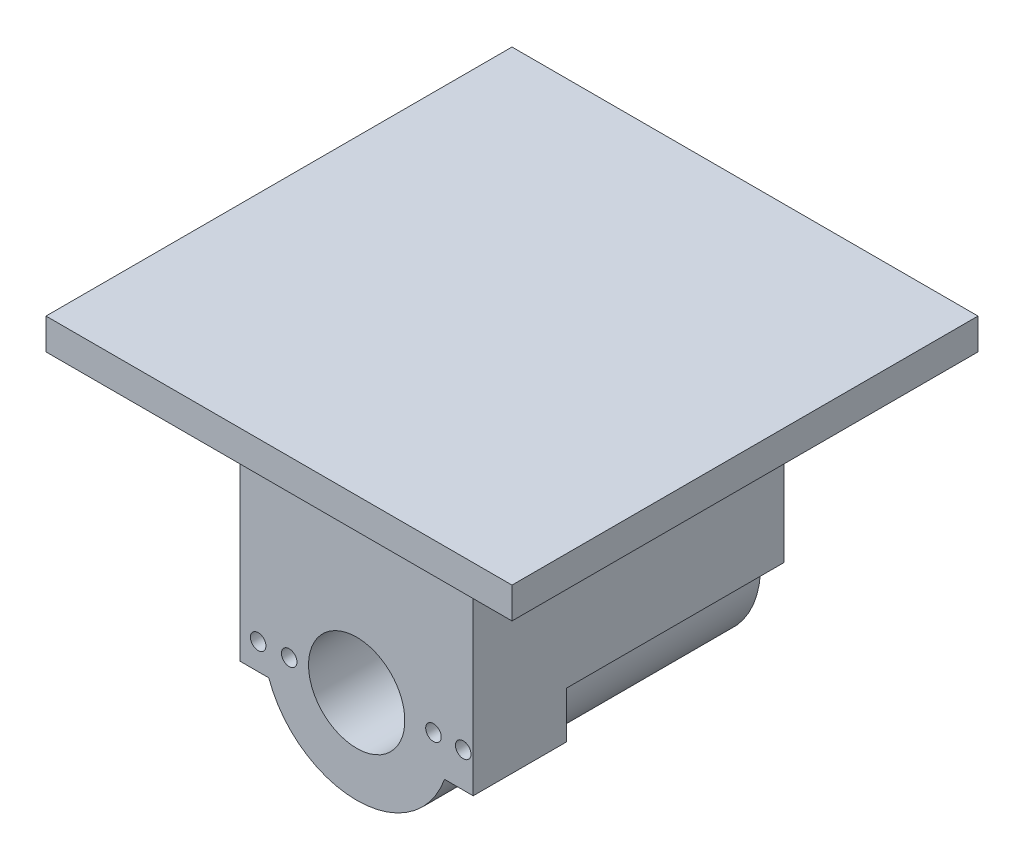
ISO-10303-21;
HEADER;
FILE_DESCRIPTION(('STEP AP214'),'2;1');
FILE_NAME('part.step','',(''),(''),'','','');
FILE_SCHEMA(('AUTOMOTIVE_DESIGN { 1 0 10303 214 1 1 1 1 }'));
ENDSEC;
DATA;
#1=APPLICATION_CONTEXT('core data for automotive mechanical design processes');
#2=APPLICATION_PROTOCOL_DEFINITION('international standard','automotive_design',2000,#1);
#3=PRODUCT_CONTEXT('',#1,'mechanical');
#4=PRODUCT('Part','Part','',(#3));
#5=PRODUCT_RELATED_PRODUCT_CATEGORY('part','',(#4));
#6=PRODUCT_DEFINITION_FORMATION('','',#4);
#7=PRODUCT_DEFINITION_CONTEXT('part definition',#1,'design');
#8=PRODUCT_DEFINITION('design','',#6,#7);
#9=PRODUCT_DEFINITION_SHAPE('','',#8);
#10=(LENGTH_UNIT() NAMED_UNIT(*) SI_UNIT(.MILLI.,.METRE.));
#11=(NAMED_UNIT(*) PLANE_ANGLE_UNIT() SI_UNIT($,.RADIAN.));
#12=(NAMED_UNIT(*) SI_UNIT($,.STERADIAN.) SOLID_ANGLE_UNIT());
#13=UNCERTAINTY_MEASURE_WITH_UNIT(LENGTH_MEASURE(1.E-05),#10,'distance_accuracy_value','');
#14=(GEOMETRIC_REPRESENTATION_CONTEXT(3) GLOBAL_UNCERTAINTY_ASSIGNED_CONTEXT((#13)) GLOBAL_UNIT_ASSIGNED_CONTEXT((#10,
#11,#12)) REPRESENTATION_CONTEXT('',''));
#15=CARTESIAN_POINT('',(0.,0.,0.));
#16=DIRECTION('',(0.,0.,1.));
#17=DIRECTION('',(1.,0.,0.));
#18=AXIS2_PLACEMENT_3D('',#15,#16,#17);
#19=CARTESIAN_POINT('',(0.,0.,20.));
#20=DIRECTION('',(0.,0.,-1.));
#21=DIRECTION('',(-1.,0.,0.));
#22=AXIS2_PLACEMENT_3D('',#19,#20,#21);
#23=CYLINDRICAL_SURFACE('',#22,6.);
#24=CARTESIAN_POINT('',(0.,0.,10.));
#25=DIRECTION('',(0.,0.,1.));
#26=DIRECTION('',(1.,0.,0.));
#27=AXIS2_PLACEMENT_3D('',#24,#25,#26);
#28=CIRCLE('',#27,6.);
#29=CARTESIAN_POINT('',(-5.99983233310653,0.0448550399568297,10.));
#30=VERTEX_POINT('',#29);
#31=CARTESIAN_POINT('',(-5.9648883188573,-0.648156881904196,10.));
#32=VERTEX_POINT('',#31);
#33=EDGE_CURVE('E292',#30,#32,#28,.T.);
#34=ORIENTED_EDGE('',*,*,#33,.F.);
#35=DIRECTION('',(0.,0.,1.));
#36=VECTOR('',#35,1.);
#37=CARTESIAN_POINT('',(-5.99983233310652,0.0448550399568282,15.));
#38=LINE('',#37,#36);
#39=CARTESIAN_POINT('',(-5.99983233310652,0.044855039956827,14.));
#40=VERTEX_POINT('',#39);
#41=EDGE_CURVE('E214',#30,#40,#38,.T.);
#42=ORIENTED_EDGE('',*,*,#41,.T.);
#43=CARTESIAN_POINT('',(0.,0.,14.));
#44=DIRECTION('',(0.,0.,1.));
#45=DIRECTION('',(1.,0.,0.));
#46=AXIS2_PLACEMENT_3D('',#43,#44,#45);
#47=CIRCLE('',#46,6.);
#48=CARTESIAN_POINT('',(-5.91607978309962,1.,14.));
#49=VERTEX_POINT('',#48);
#50=EDGE_CURVE('E224',#49,#40,#47,.T.);
#51=ORIENTED_EDGE('',*,*,#50,.F.);
#52=DIRECTION('',(0.,0.,-1.));
#53=VECTOR('',#52,1.);
#54=CARTESIAN_POINT('',(-5.91607978309962,1.,20.));
#55=LINE('',#54,#53);
#56=CARTESIAN_POINT('',(-5.91607978309961,1.,0.));
#57=VERTEX_POINT('',#56);
#58=EDGE_CURVE('E282',#49,#57,#55,.T.);
#59=ORIENTED_EDGE('',*,*,#58,.T.);
#60=CARTESIAN_POINT('',(0.,0.,0.));
#61=DIRECTION('',(0.,0.,1.));
#62=DIRECTION('',(1.,0.,0.));
#63=AXIS2_PLACEMENT_3D('',#60,#61,#62);
#64=CIRCLE('',#63,6.);
#65=CARTESIAN_POINT('',(5.91607978309962,1.,0.));
#66=VERTEX_POINT('',#65);
#67=EDGE_CURVE('E284',#57,#66,#64,.T.);
#68=ORIENTED_EDGE('',*,*,#67,.T.);
#69=DIRECTION('',(0.,0.,-1.));
#70=VECTOR('',#69,1.);
#71=CARTESIAN_POINT('',(5.91607978309962,1.,20.));
#72=LINE('',#71,#70);
#73=CARTESIAN_POINT('',(5.91607978309962,1.,14.));
#74=VERTEX_POINT('',#73);
#75=EDGE_CURVE('E279',#66,#74,#72,.F.);
#76=ORIENTED_EDGE('',*,*,#75,.T.);
#77=CARTESIAN_POINT('',(0.,0.,14.));
#78=DIRECTION('',(0.,0.,1.));
#79=DIRECTION('',(1.,0.,0.));
#80=AXIS2_PLACEMENT_3D('',#77,#78,#79);
#81=CIRCLE('',#80,6.);
#82=CARTESIAN_POINT('',(5.65685424949238,-2.,14.));
#83=VERTEX_POINT('',#82);
#84=EDGE_CURVE('E245',#83,#74,#81,.T.);
#85=ORIENTED_EDGE('',*,*,#84,.F.);
#86=DIRECTION('',(0.,0.,1.));
#87=VECTOR('',#86,1.);
#88=CARTESIAN_POINT('',(5.65685424949238,-2.,14.));
#89=LINE('',#88,#87);
#90=CARTESIAN_POINT('',(5.65685424949238,-2.,20.));
#91=VERTEX_POINT('',#90);
#92=EDGE_CURVE('E250',#83,#91,#89,.T.);
#93=ORIENTED_EDGE('',*,*,#92,.T.);
#94=CARTESIAN_POINT('',(0.,0.,20.));
#95=DIRECTION('',(0.,0.,1.));
#96=DIRECTION('',(1.,0.,0.));
#97=AXIS2_PLACEMENT_3D('',#94,#95,#96);
#98=CIRCLE('',#97,6.);
#99=CARTESIAN_POINT('',(-5.65685424949238,-2.,20.));
#100=VERTEX_POINT('',#99);
#101=EDGE_CURVE('E285',#100,#91,#98,.T.);
#102=ORIENTED_EDGE('',*,*,#101,.F.);
#103=DIRECTION('',(0.,0.,1.));
#104=VECTOR('',#103,1.);
#105=CARTESIAN_POINT('',(-5.65685424949238,-2.,14.));
#106=LINE('',#105,#104);
#107=CARTESIAN_POINT('',(-5.65685424949238,-2.,14.));
#108=VERTEX_POINT('',#107);
#109=EDGE_CURVE('E232',#108,#100,#106,.T.);
#110=ORIENTED_EDGE('',*,*,#109,.F.);
#111=CARTESIAN_POINT('',(-5.9648883188573,-0.648156881904193,14.));
#112=VERTEX_POINT('',#111);
#113=EDGE_CURVE('E223',#112,#108,#47,.T.);
#114=ORIENTED_EDGE('',*,*,#113,.F.);
#115=DIRECTION('',(0.,0.,1.));
#116=VECTOR('',#115,1.);
#117=CARTESIAN_POINT('',(-5.9648883188573,-0.648156881904194,15.));
#118=LINE('',#117,#116);
#119=EDGE_CURVE('E197',#112,#32,#118,.F.);
#120=ORIENTED_EDGE('',*,*,#119,.T.);
#121=EDGE_LOOP('',(#34,#42,#51,#59,#68,#76,#85,#93,#102,#110,#114,#120));
#122=FACE_BOUND('',#121,.T.);
#123=ADVANCED_FACE('F34',(#122),#23,.T.);
#124=CARTESIAN_POINT('',(0.,1.,0.));
#125=DIRECTION('',(0.,-1.,0.));
#126=DIRECTION('',(0.,0.,-1.));
#127=AXIS2_PLACEMENT_3D('',#124,#125,#126);
#128=PLANE('',#127);
#129=ORIENTED_EDGE('',*,*,#58,.F.);
#130=DIRECTION('',(1.,0.,0.));
#131=VECTOR('',#130,1.);
#132=CARTESIAN_POINT('',(0.,1.,14.));
#133=LINE('',#132,#131);
#134=CARTESIAN_POINT('',(-7.5,1.,14.));
#135=VERTEX_POINT('',#134);
#136=EDGE_CURVE('E227',#135,#49,#133,.T.);
#137=ORIENTED_EDGE('',*,*,#136,.F.);
#138=DIRECTION('',(0.,0.,1.));
#139=VECTOR('',#138,1.);
#140=CARTESIAN_POINT('',(-7.5,1.,0.));
#141=LINE('',#140,#139);
#142=CARTESIAN_POINT('',(-7.5,1.,0.));
#143=VERTEX_POINT('',#142);
#144=EDGE_CURVE('E259',#143,#135,#141,.T.);
#145=ORIENTED_EDGE('',*,*,#144,.F.);
#146=DIRECTION('',(-1.,0.,0.));
#147=VECTOR('',#146,1.);
#148=CARTESIAN_POINT('',(7.49999999999999,1.,0.));
#149=LINE('',#148,#147);
#150=EDGE_CURVE('E267',#57,#143,#149,.T.);
#151=ORIENTED_EDGE('',*,*,#150,.F.);
#152=EDGE_LOOP('',(#129,#137,#145,#151));
#153=FACE_BOUND('',#152,.T.);
#154=ADVANCED_FACE('F352',(#153),#128,.T.);
#155=DIRECTION('',(0.,0.,-1.));
#156=VECTOR('',#155,1.);
#157=CARTESIAN_POINT('',(7.49999999999999,1.,0.));
#158=LINE('',#157,#156);
#159=CARTESIAN_POINT('',(7.5,1.,14.));
#160=VERTEX_POINT('',#159);
#161=CARTESIAN_POINT('',(7.49999999999999,1.,0.));
#162=VERTEX_POINT('',#161);
#163=EDGE_CURVE('E264',#160,#162,#158,.T.);
#164=ORIENTED_EDGE('',*,*,#163,.F.);
#165=DIRECTION('',(1.,0.,0.));
#166=VECTOR('',#165,1.);
#167=CARTESIAN_POINT('',(0.,1.,14.));
#168=LINE('',#167,#166);
#169=EDGE_CURVE('E242',#74,#160,#168,.T.);
#170=ORIENTED_EDGE('',*,*,#169,.F.);
#171=ORIENTED_EDGE('',*,*,#75,.F.);
#172=EDGE_CURVE('E268',#162,#66,#149,.T.);
#173=ORIENTED_EDGE('',*,*,#172,.F.);
#174=EDGE_LOOP('',(#164,#170,#171,#173));
#175=FACE_BOUND('',#174,.T.);
#176=ADVANCED_FACE('F358',(#175),#128,.T.);
#177=CARTESIAN_POINT('',(0.,0.,20.));
#178=DIRECTION('',(0.,0.,1.));
#179=DIRECTION('',(1.,0.,0.));
#180=AXIS2_PLACEMENT_3D('',#177,#178,#179);
#181=PLANE('',#180);
#182=CARTESIAN_POINT('',(-6.3419428635684,-0.319782293495317,20.));
#183=DIRECTION('',(0.,0.,1.));
#184=DIRECTION('',(1.,0.,0.));
#185=AXIS2_PLACEMENT_3D('',#182,#183,#184);
#186=CIRCLE('',#185,0.499999999999999);
#187=CARTESIAN_POINT('',(-5.8419428635684,-0.319782293495317,20.));
#188=VERTEX_POINT('',#187);
#189=EDGE_CURVE('E198',#188,#188,#186,.T.);
#190=ORIENTED_EDGE('',*,*,#189,.F.);
#191=EDGE_LOOP('',(#190));
#192=FACE_BOUND('',#191,.T.);
#193=CARTESIAN_POINT('',(-4.34448054433424,-0.219063460898409,20.));
#194=DIRECTION('',(0.,0.,1.));
#195=DIRECTION('',(1.,0.,0.));
#196=AXIS2_PLACEMENT_3D('',#193,#194,#195);
#197=CIRCLE('',#196,0.499999999999999);
#198=CARTESIAN_POINT('',(-3.84448054433424,-0.219063460898409,20.));
#199=VERTEX_POINT('',#198);
#200=EDGE_CURVE('E204',#199,#199,#197,.T.);
#201=ORIENTED_EDGE('',*,*,#200,.F.);
#202=EDGE_LOOP('',(#201));
#203=FACE_BOUND('',#202,.T.);
#204=CARTESIAN_POINT('',(4.9437192401046,0.249279110677347,20.));
#205=DIRECTION('',(0.,0.,1.));
#206=DIRECTION('',(1.,0.,0.));
#207=AXIS2_PLACEMENT_3D('',#204,#205,#206);
#208=CIRCLE('',#207,0.499999999999999);
#209=CARTESIAN_POINT('',(5.4437192401046,0.249279110677347,20.));
#210=VERTEX_POINT('',#209);
#211=EDGE_CURVE('E188',#210,#210,#208,.T.);
#212=ORIENTED_EDGE('',*,*,#211,.F.);
#213=EDGE_LOOP('',(#212));
#214=FACE_BOUND('',#213,.T.);
#215=CARTESIAN_POINT('',(6.86042610133632,0.249279110677347,20.));
#216=DIRECTION('',(0.,0.,1.));
#217=DIRECTION('',(1.,0.,0.));
#218=AXIS2_PLACEMENT_3D('',#215,#216,#217);
#219=CIRCLE('',#218,0.499999999999999);
#220=CARTESIAN_POINT('',(7.36042610133632,0.249279110677347,20.));
#221=VERTEX_POINT('',#220);
#222=EDGE_CURVE('E185',#221,#221,#219,.T.);
#223=ORIENTED_EDGE('',*,*,#222,.F.);
#224=EDGE_LOOP('',(#223));
#225=FACE_BOUND('',#224,.T.);
#226=DIRECTION('',(0.,-1.,0.));
#227=VECTOR('',#226,1.);
#228=CARTESIAN_POINT('',(7.5,6.,20.));
#229=LINE('',#228,#227);
#230=CARTESIAN_POINT('',(7.5,11.,20.));
#231=VERTEX_POINT('',#230);
#232=CARTESIAN_POINT('',(7.5,-2.,20.));
#233=VERTEX_POINT('',#232);
#234=EDGE_CURVE('E275',#231,#233,#229,.T.);
#235=ORIENTED_EDGE('',*,*,#234,.F.);
#236=DIRECTION('',(1.,0.,0.));
#237=VECTOR('',#236,1.);
#238=CARTESIAN_POINT('',(-7.5,11.,20.));
#239=LINE('',#238,#237);
#240=CARTESIAN_POINT('',(-7.5,11.,20.));
#241=VERTEX_POINT('',#240);
#242=EDGE_CURVE('E58',#231,#241,#239,.F.);
#243=ORIENTED_EDGE('',*,*,#242,.T.);
#244=DIRECTION('',(0.,-1.,0.));
#245=VECTOR('',#244,1.);
#246=CARTESIAN_POINT('',(-7.5,6.,20.));
#247=LINE('',#246,#245);
#248=CARTESIAN_POINT('',(-7.5,-2.,20.));
#249=VERTEX_POINT('',#248);
#250=EDGE_CURVE('E277',#241,#249,#247,.T.);
#251=ORIENTED_EDGE('',*,*,#250,.T.);
#252=DIRECTION('',(-1.,0.,0.));
#253=VECTOR('',#252,1.);
#254=CARTESIAN_POINT('',(0.,-2.,20.));
#255=LINE('',#254,#253);
#256=EDGE_CURVE('E221',#100,#249,#255,.T.);
#257=ORIENTED_EDGE('',*,*,#256,.F.);
#258=ORIENTED_EDGE('',*,*,#101,.T.);
#259=DIRECTION('',(1.,0.,0.));
#260=VECTOR('',#259,1.);
#261=CARTESIAN_POINT('',(0.,-2.,20.));
#262=LINE('',#261,#260);
#263=EDGE_CURVE('E234',#91,#233,#262,.T.);
#264=ORIENTED_EDGE('',*,*,#263,.T.);
#265=EDGE_LOOP('',(#235,#243,#251,#257,#258,#264));
#266=FACE_BOUND('',#265,.T.);
#267=CARTESIAN_POINT('',(0.,0.,20.));
#268=DIRECTION('',(0.,0.,-1.));
#269=DIRECTION('',(-1.,0.,0.));
#270=AXIS2_PLACEMENT_3D('',#267,#268,#269);
#271=CIRCLE('',#270,3.1);
#272=CARTESIAN_POINT('',(-3.1,0.,20.));
#273=VERTEX_POINT('',#272);
#274=EDGE_CURVE('E256',#273,#273,#271,.T.);
#275=ORIENTED_EDGE('',*,*,#274,.T.);
#276=EDGE_LOOP('',(#275));
#277=FACE_BOUND('',#276,.T.);
#278=ADVANCED_FACE('F417',(#192,#203,#214,#225,#266,#277),#181,.T.);
#279=CARTESIAN_POINT('',(0.,0.,0.));
#280=DIRECTION('',(0.,0.,1.));
#281=DIRECTION('',(1.,0.,0.));
#282=AXIS2_PLACEMENT_3D('',#279,#280,#281);
#283=PLANE('',#282);
#284=CARTESIAN_POINT('',(0.,0.,0.));
#285=DIRECTION('',(0.,0.,-1.));
#286=DIRECTION('',(-1.,0.,0.));
#287=AXIS2_PLACEMENT_3D('',#284,#285,#286);
#288=CIRCLE('',#287,3.1);
#289=CARTESIAN_POINT('',(-3.1,0.,0.));
#290=VERTEX_POINT('',#289);
#291=EDGE_CURVE('E253',#290,#290,#288,.T.);
#292=ORIENTED_EDGE('',*,*,#291,.F.);
#293=EDGE_LOOP('',(#292));
#294=FACE_BOUND('',#293,.T.);
#295=DIRECTION('',(0.,-1.,0.));
#296=VECTOR('',#295,1.);
#297=CARTESIAN_POINT('',(-7.5,6.,0.));
#298=LINE('',#297,#296);
#299=CARTESIAN_POINT('',(-7.5,11.,0.));
#300=VERTEX_POINT('',#299);
#301=EDGE_CURVE('E271',#300,#143,#298,.T.);
#302=ORIENTED_EDGE('',*,*,#301,.F.);
#303=DIRECTION('',(-1.,0.,0.));
#304=VECTOR('',#303,1.);
#305=CARTESIAN_POINT('',(0.,11.,0.));
#306=LINE('',#305,#304);
#307=CARTESIAN_POINT('',(7.49999999999999,11.,0.));
#308=VERTEX_POINT('',#307);
#309=EDGE_CURVE('E11',#300,#308,#306,.F.);
#310=ORIENTED_EDGE('',*,*,#309,.T.);
#311=DIRECTION('',(0.,-1.,0.));
#312=VECTOR('',#311,1.);
#313=CARTESIAN_POINT('',(7.49999999999999,6.,0.));
#314=LINE('',#313,#312);
#315=EDGE_CURVE('E273',#308,#162,#314,.T.);
#316=ORIENTED_EDGE('',*,*,#315,.T.);
#317=ORIENTED_EDGE('',*,*,#172,.T.);
#318=ORIENTED_EDGE('',*,*,#67,.F.);
#319=ORIENTED_EDGE('',*,*,#150,.T.);
#320=EDGE_LOOP('',(#302,#310,#316,#317,#318,#319));
#321=FACE_BOUND('',#320,.T.);
#322=ADVANCED_FACE('F364',(#294,#321),#283,.F.);
#323=CARTESIAN_POINT('',(-7.5,6.,0.));
#324=DIRECTION('',(1.,0.,0.));
#325=DIRECTION('',(0.,0.,-1.));
#326=AXIS2_PLACEMENT_3D('',#323,#324,#325);
#327=PLANE('',#326);
#328=ORIENTED_EDGE('',*,*,#250,.F.);
#329=DIRECTION('',(0.,0.,1.));
#330=VECTOR('',#329,1.);
#331=CARTESIAN_POINT('',(-7.5,11.,0.));
#332=LINE('',#331,#330);
#333=EDGE_CURVE('E43',#241,#300,#332,.F.);
#334=ORIENTED_EDGE('',*,*,#333,.T.);
#335=ORIENTED_EDGE('',*,*,#301,.T.);
#336=ORIENTED_EDGE('',*,*,#144,.T.);
#337=DIRECTION('',(0.,1.,0.));
#338=VECTOR('',#337,1.);
#339=CARTESIAN_POINT('',(-7.5,0.,14.));
#340=LINE('',#339,#338);
#341=CARTESIAN_POINT('',(-7.5,-2.,14.));
#342=VERTEX_POINT('',#341);
#343=EDGE_CURVE('E218',#342,#135,#340,.T.);
#344=ORIENTED_EDGE('',*,*,#343,.F.);
#345=DIRECTION('',(0.,0.,1.));
#346=VECTOR('',#345,1.);
#347=CARTESIAN_POINT('',(-7.5,-2.,14.));
#348=LINE('',#347,#346);
#349=EDGE_CURVE('E229',#342,#249,#348,.T.);
#350=ORIENTED_EDGE('',*,*,#349,.T.);
#351=EDGE_LOOP('',(#328,#334,#335,#336,#344,#350));
#352=FACE_BOUND('',#351,.T.);
#353=ADVANCED_FACE('F406',(#352),#327,.F.);
#354=CARTESIAN_POINT('',(7.49999999999999,6.,0.));
#355=DIRECTION('',(-1.,0.,0.));
#356=DIRECTION('',(0.,0.,1.));
#357=AXIS2_PLACEMENT_3D('',#354,#355,#356);
#358=PLANE('',#357);
#359=ORIENTED_EDGE('',*,*,#315,.F.);
#360=DIRECTION('',(0.,0.,-1.));
#361=VECTOR('',#360,1.);
#362=CARTESIAN_POINT('',(7.49999999999999,11.,0.));
#363=LINE('',#362,#361);
#364=EDGE_CURVE('E305',#308,#231,#363,.F.);
#365=ORIENTED_EDGE('',*,*,#364,.T.);
#366=ORIENTED_EDGE('',*,*,#234,.T.);
#367=DIRECTION('',(0.,0.,1.));
#368=VECTOR('',#367,1.);
#369=CARTESIAN_POINT('',(7.5,-2.,14.));
#370=LINE('',#369,#368);
#371=CARTESIAN_POINT('',(7.5,-2.,14.));
#372=VERTEX_POINT('',#371);
#373=EDGE_CURVE('E247',#372,#233,#370,.T.);
#374=ORIENTED_EDGE('',*,*,#373,.F.);
#375=DIRECTION('',(0.,1.,0.));
#376=VECTOR('',#375,1.);
#377=CARTESIAN_POINT('',(7.5,0.,14.));
#378=LINE('',#377,#376);
#379=EDGE_CURVE('E240',#372,#160,#378,.T.);
#380=ORIENTED_EDGE('',*,*,#379,.T.);
#381=ORIENTED_EDGE('',*,*,#163,.T.);
#382=EDGE_LOOP('',(#359,#365,#366,#374,#380,#381));
#383=FACE_BOUND('',#382,.T.);
#384=ADVANCED_FACE('F390',(#383),#358,.F.);
#385=CARTESIAN_POINT('',(0.,0.,20.));
#386=DIRECTION('',(0.,0.,-1.));
#387=DIRECTION('',(-1.,0.,0.));
#388=AXIS2_PLACEMENT_3D('',#385,#386,#387);
#389=CYLINDRICAL_SURFACE('',#388,3.1);
#390=ORIENTED_EDGE('',*,*,#274,.F.);
#391=EDGE_LOOP('',(#390));
#392=FACE_BOUND('',#391,.T.);
#393=ORIENTED_EDGE('',*,*,#291,.T.);
#394=EDGE_LOOP('',(#393));
#395=FACE_BOUND('',#394,.T.);
#396=ADVANCED_FACE('F433',(#392,#395),#389,.F.);
#397=CARTESIAN_POINT('',(0.,-2.,14.));
#398=DIRECTION('',(0.,-1.,0.));
#399=DIRECTION('',(0.,0.,-1.));
#400=AXIS2_PLACEMENT_3D('',#397,#398,#399);
#401=PLANE('',#400);
#402=ORIENTED_EDGE('',*,*,#263,.F.);
#403=ORIENTED_EDGE('',*,*,#92,.F.);
#404=DIRECTION('',(1.,0.,0.));
#405=VECTOR('',#404,1.);
#406=CARTESIAN_POINT('',(0.,-2.,14.));
#407=LINE('',#406,#405);
#408=EDGE_CURVE('E237',#83,#372,#407,.T.);
#409=ORIENTED_EDGE('',*,*,#408,.T.);
#410=ORIENTED_EDGE('',*,*,#373,.T.);
#411=EDGE_LOOP('',(#402,#403,#409,#410));
#412=FACE_BOUND('',#411,.T.);
#413=ADVANCED_FACE('F422',(#412),#401,.T.);
#414=CARTESIAN_POINT('',(0.,0.,14.));
#415=DIRECTION('',(0.,0.,1.));
#416=DIRECTION('',(1.,0.,0.));
#417=AXIS2_PLACEMENT_3D('',#414,#415,#416);
#418=PLANE('',#417);
#419=CARTESIAN_POINT('',(6.86042610133632,0.249279110677347,14.));
#420=DIRECTION('',(0.,0.,1.));
#421=DIRECTION('',(1.,0.,0.));
#422=AXIS2_PLACEMENT_3D('',#419,#420,#421);
#423=CIRCLE('',#422,0.499999999999999);
#424=CARTESIAN_POINT('',(7.36042610133632,0.249279110677347,14.));
#425=VERTEX_POINT('',#424);
#426=EDGE_CURVE('E217',#425,#425,#423,.T.);
#427=ORIENTED_EDGE('',*,*,#426,.T.);
#428=EDGE_LOOP('',(#427));
#429=FACE_BOUND('',#428,.T.);
#430=ORIENTED_EDGE('',*,*,#408,.F.);
#431=ORIENTED_EDGE('',*,*,#84,.T.);
#432=ORIENTED_EDGE('',*,*,#169,.T.);
#433=ORIENTED_EDGE('',*,*,#379,.F.);
#434=EDGE_LOOP('',(#430,#431,#432,#433));
#435=FACE_BOUND('',#434,.T.);
#436=ADVANCED_FACE('F424',(#429,#435),#418,.F.);
#437=CARTESIAN_POINT('',(0.,-2.,14.));
#438=DIRECTION('',(0.,1.,0.));
#439=DIRECTION('',(0.,0.,1.));
#440=AXIS2_PLACEMENT_3D('',#437,#438,#439);
#441=PLANE('',#440);
#442=ORIENTED_EDGE('',*,*,#256,.T.);
#443=ORIENTED_EDGE('',*,*,#349,.F.);
#444=DIRECTION('',(-1.,0.,0.));
#445=VECTOR('',#444,1.);
#446=CARTESIAN_POINT('',(0.,-2.,14.));
#447=LINE('',#446,#445);
#448=EDGE_CURVE('E220',#108,#342,#447,.T.);
#449=ORIENTED_EDGE('',*,*,#448,.F.);
#450=ORIENTED_EDGE('',*,*,#109,.T.);
#451=EDGE_LOOP('',(#442,#443,#449,#450));
#452=FACE_BOUND('',#451,.T.);
#453=ADVANCED_FACE('F414',(#452),#441,.F.);
#454=CARTESIAN_POINT('',(0.,0.,14.));
#455=DIRECTION('',(0.,0.,1.));
#456=DIRECTION('',(1.,0.,0.));
#457=AXIS2_PLACEMENT_3D('',#454,#455,#456);
#458=PLANE('',#457);
#459=ORIENTED_EDGE('',*,*,#50,.T.);
#460=CARTESIAN_POINT('',(-6.3419428635684,-0.319782293495317,14.));
#461=DIRECTION('',(0.,0.,1.));
#462=DIRECTION('',(1.,0.,0.));
#463=AXIS2_PLACEMENT_3D('',#460,#461,#462);
#464=CIRCLE('',#463,0.499999999999999);
#465=EDGE_CURVE('E287',#40,#112,#464,.T.);
#466=ORIENTED_EDGE('',*,*,#465,.T.);
#467=ORIENTED_EDGE('',*,*,#113,.T.);
#468=ORIENTED_EDGE('',*,*,#448,.T.);
#469=ORIENTED_EDGE('',*,*,#343,.T.);
#470=ORIENTED_EDGE('',*,*,#136,.T.);
#471=EDGE_LOOP('',(#459,#466,#467,#468,#469,#470));
#472=FACE_BOUND('',#471,.T.);
#473=ADVANCED_FACE('F409',(#472),#458,.F.);
#474=CARTESIAN_POINT('',(-6.3419428635684,-0.319782293495317,10.));
#475=DIRECTION('',(0.,0.,1.));
#476=DIRECTION('',(1.,0.,0.));
#477=AXIS2_PLACEMENT_3D('',#474,#475,#476);
#478=PLANE('',#477);
#479=ORIENTED_EDGE('',*,*,#33,.T.);
#480=CARTESIAN_POINT('',(-6.3419428635684,-0.319782293495317,10.));
#481=DIRECTION('',(0.,0.,1.));
#482=DIRECTION('',(1.,0.,0.));
#483=AXIS2_PLACEMENT_3D('',#480,#481,#482);
#484=CIRCLE('',#483,0.499999999999999);
#485=EDGE_CURVE('E194',#32,#30,#484,.T.);
#486=ORIENTED_EDGE('',*,*,#485,.T.);
#487=EDGE_LOOP('',(#479,#486));
#488=FACE_BOUND('',#487,.T.);
#489=ADVANCED_FACE('F472',(#488),#478,.T.);
#490=CARTESIAN_POINT('',(-6.3419428635684,-0.319782293495317,10.));
#491=DIRECTION('',(0.,0.,1.));
#492=DIRECTION('',(1.,0.,0.));
#493=AXIS2_PLACEMENT_3D('',#490,#491,#492);
#494=CYLINDRICAL_SURFACE('',#493,0.499999999999999);
#495=ORIENTED_EDGE('',*,*,#189,.T.);
#496=EDGE_LOOP('',(#495));
#497=FACE_BOUND('',#496,.T.);
#498=ORIENTED_EDGE('',*,*,#485,.F.);
#499=ORIENTED_EDGE('',*,*,#119,.F.);
#500=ORIENTED_EDGE('',*,*,#465,.F.);
#501=ORIENTED_EDGE('',*,*,#41,.F.);
#502=EDGE_LOOP('',(#498,#499,#500,#501));
#503=FACE_BOUND('',#502,.T.);
#504=ADVANCED_FACE('F462',(#497,#503),#494,.F.);
#505=CARTESIAN_POINT('',(6.86042610133632,0.249279110677347,10.));
#506=DIRECTION('',(0.,0.,1.));
#507=DIRECTION('',(1.,0.,0.));
#508=AXIS2_PLACEMENT_3D('',#505,#506,#507);
#509=CYLINDRICAL_SURFACE('',#508,0.499999999999999);
#510=ORIENTED_EDGE('',*,*,#222,.T.);
#511=EDGE_LOOP('',(#510));
#512=FACE_BOUND('',#511,.T.);
#513=ORIENTED_EDGE('',*,*,#426,.F.);
#514=EDGE_LOOP('',(#513));
#515=FACE_BOUND('',#514,.T.);
#516=ADVANCED_FACE('F458',(#512,#515),#509,.F.);
#517=CARTESIAN_POINT('',(4.9437192401046,0.249279110677347,10.));
#518=DIRECTION('',(0.,0.,1.));
#519=DIRECTION('',(1.,0.,0.));
#520=AXIS2_PLACEMENT_3D('',#517,#518,#519);
#521=CYLINDRICAL_SURFACE('',#520,0.499999999999999);
#522=CARTESIAN_POINT('',(4.9437192401046,0.249279110677347,10.));
#523=DIRECTION('',(0.,0.,1.));
#524=DIRECTION('',(1.,0.,0.));
#525=AXIS2_PLACEMENT_3D('',#522,#523,#524);
#526=CIRCLE('',#525,0.499999999999999);
#527=CARTESIAN_POINT('',(5.4437192401046,0.249279110677347,10.));
#528=VERTEX_POINT('',#527);
#529=EDGE_CURVE('E207',#528,#528,#526,.T.);
#530=ORIENTED_EDGE('',*,*,#529,.F.);
#531=EDGE_LOOP('',(#530));
#532=FACE_BOUND('',#531,.T.);
#533=ORIENTED_EDGE('',*,*,#211,.T.);
#534=EDGE_LOOP('',(#533));
#535=FACE_BOUND('',#534,.T.);
#536=ADVANCED_FACE('F461',(#532,#535),#521,.F.);
#537=CARTESIAN_POINT('',(4.9437192401046,0.249279110677347,10.));
#538=DIRECTION('',(0.,0.,1.));
#539=DIRECTION('',(1.,0.,0.));
#540=AXIS2_PLACEMENT_3D('',#537,#538,#539);
#541=PLANE('',#540);
#542=ORIENTED_EDGE('',*,*,#529,.T.);
#543=EDGE_LOOP('',(#542));
#544=FACE_BOUND('',#543,.T.);
#545=ADVANCED_FACE('F469',(#544),#541,.T.);
#546=CARTESIAN_POINT('',(-4.34448054433424,-0.219063460898409,10.));
#547=DIRECTION('',(0.,0.,1.));
#548=DIRECTION('',(1.,0.,0.));
#549=AXIS2_PLACEMENT_3D('',#546,#547,#548);
#550=CYLINDRICAL_SURFACE('',#549,0.499999999999999);
#551=CARTESIAN_POINT('',(-4.34448054433424,-0.219063460898409,10.));
#552=DIRECTION('',(0.,0.,1.));
#553=DIRECTION('',(1.,0.,0.));
#554=AXIS2_PLACEMENT_3D('',#551,#552,#553);
#555=CIRCLE('',#554,0.499999999999999);
#556=CARTESIAN_POINT('',(-3.84448054433424,-0.219063460898409,10.));
#557=VERTEX_POINT('',#556);
#558=EDGE_CURVE('E201',#557,#557,#555,.T.);
#559=ORIENTED_EDGE('',*,*,#558,.F.);
#560=EDGE_LOOP('',(#559));
#561=FACE_BOUND('',#560,.T.);
#562=ORIENTED_EDGE('',*,*,#200,.T.);
#563=EDGE_LOOP('',(#562));
#564=FACE_BOUND('',#563,.T.);
#565=ADVANCED_FACE('F489',(#561,#564),#550,.F.);
#566=CARTESIAN_POINT('',(-4.34448054433424,-0.219063460898409,10.));
#567=DIRECTION('',(0.,0.,1.));
#568=DIRECTION('',(1.,0.,0.));
#569=AXIS2_PLACEMENT_3D('',#566,#567,#568);
#570=PLANE('',#569);
#571=ORIENTED_EDGE('',*,*,#558,.T.);
#572=EDGE_LOOP('',(#571));
#573=FACE_BOUND('',#572,.T.);
#574=ADVANCED_FACE('F486',(#573),#570,.T.);
#575=CARTESIAN_POINT('',(15.,16.,25.));
#576=DIRECTION('',(-1.,0.,0.));
#577=DIRECTION('',(0.,0.,1.));
#578=AXIS2_PLACEMENT_3D('',#575,#576,#577);
#579=PLANE('',#578);
#580=DIRECTION('',(0.,0.,-1.));
#581=VECTOR('',#580,1.);
#582=CARTESIAN_POINT('',(15.,14.,25.));
#583=LINE('',#582,#581);
#584=CARTESIAN_POINT('',(15.,14.,25.));
#585=VERTEX_POINT('',#584);
#586=CARTESIAN_POINT('',(15.,14.,-5.));
#587=VERTEX_POINT('',#586);
#588=EDGE_CURVE('E184',#585,#587,#583,.T.);
#589=ORIENTED_EDGE('',*,*,#588,.T.);
#590=DIRECTION('',(0.,-1.,0.));
#591=VECTOR('',#590,1.);
#592=CARTESIAN_POINT('',(15.,16.,-5.));
#593=LINE('',#592,#591);
#594=CARTESIAN_POINT('',(15.,16.,-5.));
#595=VERTEX_POINT('',#594);
#596=EDGE_CURVE('E164',#595,#587,#593,.T.);
#597=ORIENTED_EDGE('',*,*,#596,.F.);
#598=DIRECTION('',(0.,0.,-1.));
#599=VECTOR('',#598,1.);
#600=CARTESIAN_POINT('',(15.,16.,25.));
#601=LINE('',#600,#599);
#602=CARTESIAN_POINT('',(15.,16.,25.));
#603=VERTEX_POINT('',#602);
#604=EDGE_CURVE('E171',#603,#595,#601,.T.);
#605=ORIENTED_EDGE('',*,*,#604,.F.);
#606=DIRECTION('',(0.,-1.,0.));
#607=VECTOR('',#606,1.);
#608=CARTESIAN_POINT('',(15.,16.,25.));
#609=LINE('',#608,#607);
#610=EDGE_CURVE('E332',#603,#585,#609,.T.);
#611=ORIENTED_EDGE('',*,*,#610,.T.);
#612=EDGE_LOOP('',(#589,#597,#605,#611));
#613=FACE_BOUND('',#612,.T.);
#614=ADVANCED_FACE('F182',(#613),#579,.F.);
#615=CARTESIAN_POINT('',(-15.,16.,-5.));
#616=DIRECTION('',(0.,0.,1.));
#617=DIRECTION('',(1.,0.,0.));
#618=AXIS2_PLACEMENT_3D('',#615,#616,#617);
#619=PLANE('',#618);
#620=DIRECTION('',(-1.,0.,0.));
#621=VECTOR('',#620,1.);
#622=CARTESIAN_POINT('',(-15.,14.,-5.));
#623=LINE('',#622,#621);
#624=CARTESIAN_POINT('',(-15.,14.,-5.));
#625=VERTEX_POINT('',#624);
#626=EDGE_CURVE('E323',#587,#625,#623,.T.);
#627=ORIENTED_EDGE('',*,*,#626,.T.);
#628=DIRECTION('',(0.,-1.,0.));
#629=VECTOR('',#628,1.);
#630=CARTESIAN_POINT('',(-15.,16.,-5.));
#631=LINE('',#630,#629);
#632=CARTESIAN_POINT('',(-15.,16.,-5.));
#633=VERTEX_POINT('',#632);
#634=EDGE_CURVE('E167',#633,#625,#631,.T.);
#635=ORIENTED_EDGE('',*,*,#634,.F.);
#636=DIRECTION('',(-1.,0.,0.));
#637=VECTOR('',#636,1.);
#638=CARTESIAN_POINT('',(-15.,16.,-5.));
#639=LINE('',#638,#637);
#640=EDGE_CURVE('E160',#595,#633,#639,.T.);
#641=ORIENTED_EDGE('',*,*,#640,.F.);
#642=ORIENTED_EDGE('',*,*,#596,.T.);
#643=EDGE_LOOP('',(#627,#635,#641,#642));
#644=FACE_BOUND('',#643,.T.);
#645=ADVANCED_FACE('F162',(#644),#619,.F.);
#646=CARTESIAN_POINT('',(-15.,16.,25.));
#647=DIRECTION('',(1.,0.,0.));
#648=DIRECTION('',(0.,0.,-1.));
#649=AXIS2_PLACEMENT_3D('',#646,#647,#648);
#650=PLANE('',#649);
#651=DIRECTION('',(0.,0.,1.));
#652=VECTOR('',#651,1.);
#653=CARTESIAN_POINT('',(-15.,14.,25.));
#654=LINE('',#653,#652);
#655=CARTESIAN_POINT('',(-15.,14.,25.));
#656=VERTEX_POINT('',#655);
#657=EDGE_CURVE('E325',#625,#656,#654,.T.);
#658=ORIENTED_EDGE('',*,*,#657,.T.);
#659=DIRECTION('',(0.,-1.,0.));
#660=VECTOR('',#659,1.);
#661=CARTESIAN_POINT('',(-15.,16.,25.));
#662=LINE('',#661,#660);
#663=CARTESIAN_POINT('',(-15.,16.,25.));
#664=VERTEX_POINT('',#663);
#665=EDGE_CURVE('E190',#664,#656,#662,.T.);
#666=ORIENTED_EDGE('',*,*,#665,.F.);
#667=DIRECTION('',(0.,0.,1.));
#668=VECTOR('',#667,1.);
#669=CARTESIAN_POINT('',(-15.,16.,25.));
#670=LINE('',#669,#668);
#671=EDGE_CURVE('E170',#633,#664,#670,.T.);
#672=ORIENTED_EDGE('',*,*,#671,.F.);
#673=ORIENTED_EDGE('',*,*,#634,.T.);
#674=EDGE_LOOP('',(#658,#666,#672,#673));
#675=FACE_BOUND('',#674,.T.);
#676=ADVANCED_FACE('F342',(#675),#650,.F.);
#677=CARTESIAN_POINT('',(-15.,16.,25.));
#678=DIRECTION('',(0.,0.,-1.));
#679=DIRECTION('',(-1.,0.,0.));
#680=AXIS2_PLACEMENT_3D('',#677,#678,#679);
#681=PLANE('',#680);
#682=DIRECTION('',(1.,0.,0.));
#683=VECTOR('',#682,1.);
#684=CARTESIAN_POINT('',(-15.,14.,25.));
#685=LINE('',#684,#683);
#686=EDGE_CURVE('E180',#656,#585,#685,.T.);
#687=ORIENTED_EDGE('',*,*,#686,.T.);
#688=ORIENTED_EDGE('',*,*,#610,.F.);
#689=DIRECTION('',(1.,0.,0.));
#690=VECTOR('',#689,1.);
#691=CARTESIAN_POINT('',(-15.,16.,25.));
#692=LINE('',#691,#690);
#693=EDGE_CURVE('E176',#664,#603,#692,.T.);
#694=ORIENTED_EDGE('',*,*,#693,.F.);
#695=ORIENTED_EDGE('',*,*,#665,.T.);
#696=EDGE_LOOP('',(#687,#688,#694,#695));
#697=FACE_BOUND('',#696,.T.);
#698=ADVANCED_FACE('F337',(#697),#681,.F.);
#699=CARTESIAN_POINT('',(0.,16.,0.));
#700=DIRECTION('',(0.,-1.,0.));
#701=DIRECTION('',(0.,0.,-1.));
#702=AXIS2_PLACEMENT_3D('',#699,#700,#701);
#703=PLANE('',#702);
#704=ORIENTED_EDGE('',*,*,#604,.T.);
#705=ORIENTED_EDGE('',*,*,#640,.T.);
#706=ORIENTED_EDGE('',*,*,#671,.T.);
#707=ORIENTED_EDGE('',*,*,#693,.T.);
#708=EDGE_LOOP('',(#704,#705,#706,#707));
#709=FACE_BOUND('',#708,.T.);
#710=ADVANCED_FACE('F174',(#709),#703,.F.);
#711=CARTESIAN_POINT('',(0.,14.,0.));
#712=DIRECTION('',(0.,-1.,0.));
#713=DIRECTION('',(0.,0.,-1.));
#714=AXIS2_PLACEMENT_3D('',#711,#712,#713);
#715=PLANE('',#714);
#716=DIRECTION('',(1.,0.,0.));
#717=VECTOR('',#716,1.);
#718=CARTESIAN_POINT('',(7.5,14.,23.));
#719=LINE('',#718,#717);
#720=CARTESIAN_POINT('',(-10.5,14.,23.));
#721=VERTEX_POINT('',#720);
#722=CARTESIAN_POINT('',(10.5,14.,23.));
#723=VERTEX_POINT('',#722);
#724=EDGE_CURVE('E300',#721,#723,#719,.T.);
#725=ORIENTED_EDGE('',*,*,#724,.T.);
#726=DIRECTION('',(0.,0.,-1.));
#727=VECTOR('',#726,1.);
#728=CARTESIAN_POINT('',(10.5,14.,0.));
#729=LINE('',#728,#727);
#730=CARTESIAN_POINT('',(10.5,14.,-3.));
#731=VERTEX_POINT('',#730);
#732=EDGE_CURVE('E302',#723,#731,#729,.T.);
#733=ORIENTED_EDGE('',*,*,#732,.T.);
#734=DIRECTION('',(-1.,0.,0.));
#735=VECTOR('',#734,1.);
#736=CARTESIAN_POINT('',(0.,14.,-3.));
#737=LINE('',#736,#735);
#738=CARTESIAN_POINT('',(-10.5,14.,-3.));
#739=VERTEX_POINT('',#738);
#740=EDGE_CURVE('E296',#731,#739,#737,.T.);
#741=ORIENTED_EDGE('',*,*,#740,.T.);
#742=DIRECTION('',(0.,0.,1.));
#743=VECTOR('',#742,1.);
#744=CARTESIAN_POINT('',(-10.5,14.,0.));
#745=LINE('',#744,#743);
#746=EDGE_CURVE('E298',#739,#721,#745,.T.);
#747=ORIENTED_EDGE('',*,*,#746,.T.);
#748=EDGE_LOOP('',(#725,#733,#741,#747));
#749=FACE_BOUND('',#748,.T.);
#750=ORIENTED_EDGE('',*,*,#588,.F.);
#751=ORIENTED_EDGE('',*,*,#686,.F.);
#752=ORIENTED_EDGE('',*,*,#657,.F.);
#753=ORIENTED_EDGE('',*,*,#626,.F.);
#754=EDGE_LOOP('',(#750,#751,#752,#753));
#755=FACE_BOUND('',#754,.T.);
#756=ADVANCED_FACE('F341',(#749,#755),#715,.T.);
#757=CARTESIAN_POINT('',(-10.5,11.,0.));
#758=DIRECTION('',(0.,0.,1.));
#759=DIRECTION('',(1.,0.,0.));
#760=AXIS2_PLACEMENT_3D('',#757,#758,#759);
#761=CYLINDRICAL_SURFACE('',#760,3.);
#762=CARTESIAN_POINT('',(-10.5,11.,-3.));
#763=DIRECTION('',(-0.707106781186547,0.,0.707106781186548));
#764=DIRECTION('',(-0.707106781186548,0.,-0.707106781186547));
#765=AXIS2_PLACEMENT_3D('',#762,#763,#764);
#766=ELLIPSE('',#765,4.24264068711929,3.);
#767=EDGE_CURVE('E313',#300,#739,#766,.T.);
#768=ORIENTED_EDGE('',*,*,#767,.F.);
#769=ORIENTED_EDGE('',*,*,#333,.F.);
#770=CARTESIAN_POINT('',(-10.5,11.,23.));
#771=DIRECTION('',(0.707106781186548,0.,0.707106781186547));
#772=DIRECTION('',(-0.707106781186547,0.,0.707106781186548));
#773=AXIS2_PLACEMENT_3D('',#770,#771,#772);
#774=ELLIPSE('',#773,4.24264068711928,3.);
#775=EDGE_CURVE('E38',#721,#241,#774,.F.);
#776=ORIENTED_EDGE('',*,*,#775,.F.);
#777=ORIENTED_EDGE('',*,*,#746,.F.);
#778=EDGE_LOOP('',(#768,#769,#776,#777));
#779=FACE_BOUND('',#778,.T.);
#780=ADVANCED_FACE('F36',(#779),#761,.F.);
#781=CARTESIAN_POINT('',(0.,11.,23.));
#782=DIRECTION('',(-1.,0.,0.));
#783=DIRECTION('',(0.,0.,1.));
#784=AXIS2_PLACEMENT_3D('',#781,#782,#783);
#785=CYLINDRICAL_SURFACE('',#784,3.);
#786=ORIENTED_EDGE('',*,*,#775,.T.);
#787=ORIENTED_EDGE('',*,*,#242,.F.);
#788=CARTESIAN_POINT('',(10.5,11.,23.));
#789=DIRECTION('',(-0.707106781186547,0.,0.707106781186548));
#790=DIRECTION('',(-0.707106781186548,0.,-0.707106781186547));
#791=AXIS2_PLACEMENT_3D('',#788,#789,#790);
#792=ELLIPSE('',#791,4.24264068711929,3.);
#793=EDGE_CURVE('E312',#723,#231,#792,.T.);
#794=ORIENTED_EDGE('',*,*,#793,.F.);
#795=ORIENTED_EDGE('',*,*,#724,.F.);
#796=EDGE_LOOP('',(#786,#787,#794,#795));
#797=FACE_BOUND('',#796,.T.);
#798=ADVANCED_FACE('F372',(#797),#785,.F.);
#799=CARTESIAN_POINT('',(0.,11.,-3.));
#800=DIRECTION('',(-1.,0.,0.));
#801=DIRECTION('',(0.,0.,1.));
#802=AXIS2_PLACEMENT_3D('',#799,#800,#801);
#803=CYLINDRICAL_SURFACE('',#802,3.);
#804=ORIENTED_EDGE('',*,*,#767,.T.);
#805=ORIENTED_EDGE('',*,*,#740,.F.);
#806=CARTESIAN_POINT('',(10.5,11.,-3.));
#807=DIRECTION('',(-0.707106781186548,0.,-0.707106781186547));
#808=DIRECTION('',(-0.707106781186547,0.,0.707106781186548));
#809=AXIS2_PLACEMENT_3D('',#806,#807,#808);
#810=ELLIPSE('',#809,4.24264068711928,3.);
#811=EDGE_CURVE('E310',#308,#731,#810,.T.);
#812=ORIENTED_EDGE('',*,*,#811,.F.);
#813=ORIENTED_EDGE('',*,*,#309,.F.);
#814=EDGE_LOOP('',(#804,#805,#812,#813));
#815=FACE_BOUND('',#814,.T.);
#816=ADVANCED_FACE('F369',(#815),#803,.F.);
#817=CARTESIAN_POINT('',(10.5,11.,0.));
#818=DIRECTION('',(0.,0.,-1.));
#819=DIRECTION('',(-1.,0.,0.));
#820=AXIS2_PLACEMENT_3D('',#817,#818,#819);
#821=CYLINDRICAL_SURFACE('',#820,3.);
#822=ORIENTED_EDGE('',*,*,#793,.T.);
#823=ORIENTED_EDGE('',*,*,#364,.F.);
#824=ORIENTED_EDGE('',*,*,#811,.T.);
#825=ORIENTED_EDGE('',*,*,#732,.F.);
#826=EDGE_LOOP('',(#822,#823,#824,#825));
#827=FACE_BOUND('',#826,.T.);
#828=ADVANCED_FACE('F366',(#827),#821,.F.);
#829=CLOSED_SHELL('',(#123,#154,#176,#278,#322,#353,#384,#396,#413,#436,#453,#473,#489,#504,
#516,#536,#545,#565,#574,#614,#645,#676,#698,#710,#756,#780,#798,#816,#828));
#830=MANIFOLD_SOLID_BREP('B2',#829);
#831=ADVANCED_BREP_SHAPE_REPRESENTATION('',(#18,#830),#14);
#832=SHAPE_DEFINITION_REPRESENTATION(#9,#831);
ENDSEC;
END-ISO-10303-21;
